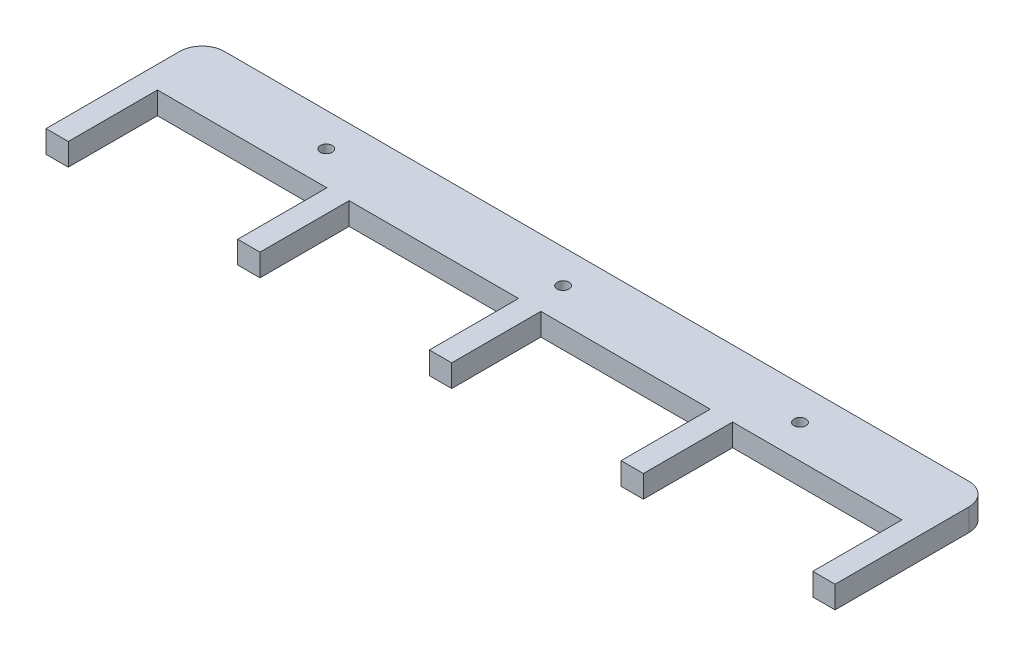
ISO-10303-21;
HEADER;
FILE_DESCRIPTION(('STEP AP214'),'2;1');
FILE_NAME('part.step','',(''),(''),'','','');
FILE_SCHEMA(('AUTOMOTIVE_DESIGN { 1 0 10303 214 1 1 1 1 }'));
ENDSEC;
DATA;
#1=APPLICATION_CONTEXT('core data for automotive mechanical design processes');
#2=APPLICATION_PROTOCOL_DEFINITION('international standard','automotive_design',2000,#1);
#3=PRODUCT_CONTEXT('',#1,'mechanical');
#4=PRODUCT('Part','Part','',(#3));
#5=PRODUCT_RELATED_PRODUCT_CATEGORY('part','',(#4));
#6=PRODUCT_DEFINITION_FORMATION('','',#4);
#7=PRODUCT_DEFINITION_CONTEXT('part definition',#1,'design');
#8=PRODUCT_DEFINITION('design','',#6,#7);
#9=PRODUCT_DEFINITION_SHAPE('','',#8);
#10=(LENGTH_UNIT() NAMED_UNIT(*) SI_UNIT(.MILLI.,.METRE.));
#11=(NAMED_UNIT(*) PLANE_ANGLE_UNIT() SI_UNIT($,.RADIAN.));
#12=(NAMED_UNIT(*) SI_UNIT($,.STERADIAN.) SOLID_ANGLE_UNIT());
#13=UNCERTAINTY_MEASURE_WITH_UNIT(LENGTH_MEASURE(1.E-05),#10,'distance_accuracy_value','');
#14=(GEOMETRIC_REPRESENTATION_CONTEXT(3) GLOBAL_UNCERTAINTY_ASSIGNED_CONTEXT((#13)) GLOBAL_UNIT_ASSIGNED_CONTEXT((#10,
#11,#12)) REPRESENTATION_CONTEXT('',''));
#15=CARTESIAN_POINT('',(0.,0.,0.));
#16=DIRECTION('',(0.,0.,1.));
#17=DIRECTION('',(1.,0.,0.));
#18=AXIS2_PLACEMENT_3D('',#15,#16,#17);
#19=CARTESIAN_POINT('',(86.756875,6.35,-82.55));
#20=DIRECTION('',(0.,-1.,0.));
#21=DIRECTION('',(0.,0.,-1.));
#22=AXIS2_PLACEMENT_3D('',#19,#20,#21);
#23=PLANE('',#22);
#24=CARTESIAN_POINT('',(-19.288125,6.35,-79.375));
#25=DIRECTION('',(0.,1.,0.));
#26=DIRECTION('',(0.,0.,1.));
#27=AXIS2_PLACEMENT_3D('',#24,#25,#26);
#28=CIRCLE('',#27,1.70000000000001);
#29=CARTESIAN_POINT('',(-19.288125,6.35,-77.675));
#30=VERTEX_POINT('',#29);
#31=EDGE_CURVE('E417',#30,#30,#28,.T.);
#32=ORIENTED_EDGE('',*,*,#31,.F.);
#33=EDGE_LOOP('',(#32));
#34=FACE_BOUND('',#33,.T.);
#35=DIRECTION('',(1.,0.,0.));
#36=VECTOR('',#35,1.);
#37=CARTESIAN_POINT('',(-131.683125,6.35,-44.45));
#38=LINE('',#37,#36);
#39=CARTESIAN_POINT('',(-131.683125,6.35,-44.45));
#40=VERTEX_POINT('',#39);
#41=CARTESIAN_POINT('',(-125.333125,6.35,-44.45));
#42=VERTEX_POINT('',#41);
#43=EDGE_CURVE('E257',#40,#42,#38,.T.);
#44=ORIENTED_EDGE('',*,*,#43,.T.);
#45=DIRECTION('',(0.,0.,-1.));
#46=VECTOR('',#45,1.);
#47=CARTESIAN_POINT('',(-125.333125,6.35,-69.85));
#48=LINE('',#47,#46);
#49=CARTESIAN_POINT('',(-125.333125,6.35,-69.85));
#50=VERTEX_POINT('',#49);
#51=EDGE_CURVE('E135',#42,#50,#48,.T.);
#52=ORIENTED_EDGE('',*,*,#51,.T.);
#53=DIRECTION('',(1.,0.,0.));
#54=VECTOR('',#53,1.);
#55=CARTESIAN_POINT('',(-125.333125,6.35,-69.85));
#56=LINE('',#55,#54);
#57=CARTESIAN_POINT('',(-77.073125,6.35,-69.85));
#58=VERTEX_POINT('',#57);
#59=EDGE_CURVE('E314',#50,#58,#56,.T.);
#60=ORIENTED_EDGE('',*,*,#59,.T.);
#61=DIRECTION('',(0.,0.,1.));
#62=VECTOR('',#61,1.);
#63=CARTESIAN_POINT('',(-77.073125,6.35,-44.45));
#64=LINE('',#63,#62);
#65=CARTESIAN_POINT('',(-77.073125,6.35,-44.45));
#66=VERTEX_POINT('',#65);
#67=EDGE_CURVE('E333',#58,#66,#64,.T.);
#68=ORIENTED_EDGE('',*,*,#67,.T.);
#69=DIRECTION('',(1.,0.,0.));
#70=VECTOR('',#69,1.);
#71=CARTESIAN_POINT('',(-77.073125,6.35,-44.45));
#72=LINE('',#71,#70);
#73=CARTESIAN_POINT('',(-70.723125,6.35,-44.45));
#74=VERTEX_POINT('',#73);
#75=EDGE_CURVE('E330',#66,#74,#72,.T.);
#76=ORIENTED_EDGE('',*,*,#75,.T.);
#77=DIRECTION('',(0.,0.,-1.));
#78=VECTOR('',#77,1.);
#79=CARTESIAN_POINT('',(-70.723125,6.35,-44.45));
#80=LINE('',#79,#78);
#81=CARTESIAN_POINT('',(-70.723125,6.35,-69.85));
#82=VERTEX_POINT('',#81);
#83=EDGE_CURVE('E332',#74,#82,#80,.T.);
#84=ORIENTED_EDGE('',*,*,#83,.T.);
#85=DIRECTION('',(1.,0.,0.));
#86=VECTOR('',#85,1.);
#87=CARTESIAN_POINT('',(-70.723125,6.35,-69.85));
#88=LINE('',#87,#86);
#89=CARTESIAN_POINT('',(-22.463125,6.35,-69.85));
#90=VERTEX_POINT('',#89);
#91=EDGE_CURVE('E335',#82,#90,#88,.T.);
#92=ORIENTED_EDGE('',*,*,#91,.T.);
#93=DIRECTION('',(0.,0.,1.));
#94=VECTOR('',#93,1.);
#95=CARTESIAN_POINT('',(-22.463125,6.35,-69.85));
#96=LINE('',#95,#94);
#97=CARTESIAN_POINT('',(-22.463125,6.35,-44.45));
#98=VERTEX_POINT('',#97);
#99=EDGE_CURVE('E341',#90,#98,#96,.T.);
#100=ORIENTED_EDGE('',*,*,#99,.T.);
#101=DIRECTION('',(1.,0.,0.));
#102=VECTOR('',#101,1.);
#103=CARTESIAN_POINT('',(-22.463125,6.35,-44.45));
#104=LINE('',#103,#102);
#105=CARTESIAN_POINT('',(-16.113125,6.35,-44.45));
#106=VERTEX_POINT('',#105);
#107=EDGE_CURVE('E343',#98,#106,#104,.T.);
#108=ORIENTED_EDGE('',*,*,#107,.T.);
#109=DIRECTION('',(0.,0.,-1.));
#110=VECTOR('',#109,1.);
#111=CARTESIAN_POINT('',(-16.113125,6.35,-44.45));
#112=LINE('',#111,#110);
#113=CARTESIAN_POINT('',(-16.113125,6.35,-69.85));
#114=VERTEX_POINT('',#113);
#115=EDGE_CURVE('E345',#106,#114,#112,.T.);
#116=ORIENTED_EDGE('',*,*,#115,.T.);
#117=DIRECTION('',(1.,0.,0.));
#118=VECTOR('',#117,1.);
#119=CARTESIAN_POINT('',(-16.113125,6.35,-69.85));
#120=LINE('',#119,#118);
#121=CARTESIAN_POINT('',(32.146875,6.35,-69.85));
#122=VERTEX_POINT('',#121);
#123=EDGE_CURVE('E347',#114,#122,#120,.T.);
#124=ORIENTED_EDGE('',*,*,#123,.T.);
#125=DIRECTION('',(0.,0.,1.));
#126=VECTOR('',#125,1.);
#127=CARTESIAN_POINT('',(32.146875,6.35,-69.85));
#128=LINE('',#127,#126);
#129=CARTESIAN_POINT('',(32.146875,6.35,-44.45));
#130=VERTEX_POINT('',#129);
#131=EDGE_CURVE('E349',#122,#130,#128,.T.);
#132=ORIENTED_EDGE('',*,*,#131,.T.);
#133=DIRECTION('',(1.,0.,0.));
#134=VECTOR('',#133,1.);
#135=CARTESIAN_POINT('',(32.146875,6.35,-44.45));
#136=LINE('',#135,#134);
#137=CARTESIAN_POINT('',(38.496875,6.35,-44.45));
#138=VERTEX_POINT('',#137);
#139=EDGE_CURVE('E351',#130,#138,#136,.T.);
#140=ORIENTED_EDGE('',*,*,#139,.T.);
#141=DIRECTION('',(0.,0.,-1.));
#142=VECTOR('',#141,1.);
#143=CARTESIAN_POINT('',(38.496875,6.35,-44.45));
#144=LINE('',#143,#142);
#145=CARTESIAN_POINT('',(38.496875,6.35,-69.85));
#146=VERTEX_POINT('',#145);
#147=EDGE_CURVE('E353',#138,#146,#144,.T.);
#148=ORIENTED_EDGE('',*,*,#147,.T.);
#149=DIRECTION('',(1.,0.,0.));
#150=VECTOR('',#149,1.);
#151=CARTESIAN_POINT('',(38.496875,6.35,-69.85));
#152=LINE('',#151,#150);
#153=CARTESIAN_POINT('',(86.756875,6.35,-69.85));
#154=VERTEX_POINT('',#153);
#155=EDGE_CURVE('E355',#146,#154,#152,.T.);
#156=ORIENTED_EDGE('',*,*,#155,.T.);
#157=DIRECTION('',(0.,0.,1.));
#158=VECTOR('',#157,1.);
#159=CARTESIAN_POINT('',(86.756875,6.35,-69.85));
#160=LINE('',#159,#158);
#161=CARTESIAN_POINT('',(86.756875,6.35,-44.45));
#162=VERTEX_POINT('',#161);
#163=EDGE_CURVE('E357',#154,#162,#160,.T.);
#164=ORIENTED_EDGE('',*,*,#163,.T.);
#165=DIRECTION('',(1.,0.,0.));
#166=VECTOR('',#165,1.);
#167=CARTESIAN_POINT('',(86.756875,6.35,-44.45));
#168=LINE('',#167,#166);
#169=CARTESIAN_POINT('',(93.106875,6.35,-44.45));
#170=VERTEX_POINT('',#169);
#171=EDGE_CURVE('E359',#162,#170,#168,.T.);
#172=ORIENTED_EDGE('',*,*,#171,.T.);
#173=DIRECTION('',(0.,0.,-1.));
#174=VECTOR('',#173,1.);
#175=CARTESIAN_POINT('',(93.106875,6.35,-44.45));
#176=LINE('',#175,#174);
#177=CARTESIAN_POINT('',(93.106875,6.35,-82.55));
#178=VERTEX_POINT('',#177);
#179=EDGE_CURVE('E361',#170,#178,#176,.T.);
#180=ORIENTED_EDGE('',*,*,#179,.T.);
#181=CARTESIAN_POINT('',(86.756875,6.35,-82.55));
#182=DIRECTION('',(0.,1.,0.));
#183=DIRECTION('',(0.,0.,-1.));
#184=AXIS2_PLACEMENT_3D('',#181,#182,#183);
#185=CIRCLE('',#184,6.34999999999999);
#186=CARTESIAN_POINT('',(86.756875,6.35,-88.9));
#187=VERTEX_POINT('',#186);
#188=EDGE_CURVE('E196',#178,#187,#185,.T.);
#189=ORIENTED_EDGE('',*,*,#188,.T.);
#190=DIRECTION('',(-1.,0.,0.));
#191=VECTOR('',#190,1.);
#192=CARTESIAN_POINT('',(86.756875,6.35,-88.9));
#193=LINE('',#192,#191);
#194=CARTESIAN_POINT('',(-125.333125,6.35,-88.9));
#195=VERTEX_POINT('',#194);
#196=EDGE_CURVE('E190',#187,#195,#193,.T.);
#197=ORIENTED_EDGE('',*,*,#196,.T.);
#198=CARTESIAN_POINT('',(-125.333125,6.35,-82.55));
#199=DIRECTION('',(0.,1.,0.));
#200=DIRECTION('',(0.,0.,1.));
#201=AXIS2_PLACEMENT_3D('',#198,#199,#200);
#202=CIRCLE('',#201,6.34999999999999);
#203=CARTESIAN_POINT('',(-131.683125,6.35,-82.55));
#204=VERTEX_POINT('',#203);
#205=EDGE_CURVE('E194',#195,#204,#202,.T.);
#206=ORIENTED_EDGE('',*,*,#205,.T.);
#207=DIRECTION('',(0.,0.,1.));
#208=VECTOR('',#207,1.);
#209=CARTESIAN_POINT('',(-131.683125,6.35,-82.55));
#210=LINE('',#209,#208);
#211=EDGE_CURVE('E50',#204,#40,#210,.T.);
#212=ORIENTED_EDGE('',*,*,#211,.T.);
#213=EDGE_LOOP('',(#44,#52,#60,#68,#76,#84,#92,#100,#108,#116,#124,#132,#140,#148,#156,#164,
#172,#180,#189,#197,#206,#212));
#214=FACE_BOUND('',#213,.T.);
#215=CARTESIAN_POINT('',(-86.756875,6.35,-79.375));
#216=DIRECTION('',(0.,1.,0.));
#217=DIRECTION('',(0.,0.,1.));
#218=AXIS2_PLACEMENT_3D('',#215,#216,#217);
#219=CIRCLE('',#218,1.70000000000001);
#220=CARTESIAN_POINT('',(-86.756875,6.35,-77.6749999999999));
#221=VERTEX_POINT('',#220);
#222=EDGE_CURVE('E218',#221,#221,#219,.T.);
#223=ORIENTED_EDGE('',*,*,#222,.F.);
#224=EDGE_LOOP('',(#223));
#225=FACE_BOUND('',#224,.T.);
#226=CARTESIAN_POINT('',(48.180625,6.35,-79.375));
#227=DIRECTION('',(0.,1.,0.));
#228=DIRECTION('',(0.,0.,1.));
#229=AXIS2_PLACEMENT_3D('',#226,#227,#228);
#230=CIRCLE('',#229,1.7);
#231=CARTESIAN_POINT('',(48.180625,6.35,-77.675));
#232=VERTEX_POINT('',#231);
#233=EDGE_CURVE('E408',#232,#232,#230,.T.);
#234=ORIENTED_EDGE('',*,*,#233,.F.);
#235=EDGE_LOOP('',(#234));
#236=FACE_BOUND('',#235,.T.);
#237=ADVANCED_FACE('F33',(#34,#214,#225,#236),#23,.F.);
#238=CARTESIAN_POINT('',(86.756875,0.,-82.55));
#239=DIRECTION('',(0.,-1.,0.));
#240=DIRECTION('',(0.,0.,-1.));
#241=AXIS2_PLACEMENT_3D('',#238,#239,#240);
#242=PLANE('',#241);
#243=CARTESIAN_POINT('',(-19.288125,0.,-79.375));
#244=DIRECTION('',(0.,1.,0.));
#245=DIRECTION('',(0.,0.,1.));
#246=AXIS2_PLACEMENT_3D('',#243,#244,#245);
#247=CIRCLE('',#246,1.70000000000001);
#248=CARTESIAN_POINT('',(-19.288125,0.,-77.675));
#249=VERTEX_POINT('',#248);
#250=EDGE_CURVE('E414',#249,#249,#247,.T.);
#251=ORIENTED_EDGE('',*,*,#250,.T.);
#252=EDGE_LOOP('',(#251));
#253=FACE_BOUND('',#252,.T.);
#254=DIRECTION('',(1.,0.,0.));
#255=VECTOR('',#254,1.);
#256=CARTESIAN_POINT('',(-131.683125,0.,-44.45));
#257=LINE('',#256,#255);
#258=CARTESIAN_POINT('',(-131.683125,0.,-44.45));
#259=VERTEX_POINT('',#258);
#260=CARTESIAN_POINT('',(-125.333125,0.,-44.45));
#261=VERTEX_POINT('',#260);
#262=EDGE_CURVE('E214',#259,#261,#257,.T.);
#263=ORIENTED_EDGE('',*,*,#262,.F.);
#264=DIRECTION('',(0.,0.,1.));
#265=VECTOR('',#264,1.);
#266=CARTESIAN_POINT('',(-131.683125,0.,-82.55));
#267=LINE('',#266,#265);
#268=CARTESIAN_POINT('',(-131.683125,0.,-82.55));
#269=VERTEX_POINT('',#268);
#270=EDGE_CURVE('E127',#269,#259,#267,.T.);
#271=ORIENTED_EDGE('',*,*,#270,.F.);
#272=CARTESIAN_POINT('',(-125.333125,0.,-82.55));
#273=DIRECTION('',(0.,1.,0.));
#274=DIRECTION('',(0.,0.,1.));
#275=AXIS2_PLACEMENT_3D('',#272,#273,#274);
#276=CIRCLE('',#275,6.34999999999999);
#277=CARTESIAN_POINT('',(-125.333125,0.,-88.9));
#278=VERTEX_POINT('',#277);
#279=EDGE_CURVE('E121',#278,#269,#276,.T.);
#280=ORIENTED_EDGE('',*,*,#279,.F.);
#281=DIRECTION('',(-1.,0.,0.));
#282=VECTOR('',#281,1.);
#283=CARTESIAN_POINT('',(86.756875,0.,-88.9));
#284=LINE('',#283,#282);
#285=CARTESIAN_POINT('',(86.756875,0.,-88.9));
#286=VERTEX_POINT('',#285);
#287=EDGE_CURVE('E204',#286,#278,#284,.T.);
#288=ORIENTED_EDGE('',*,*,#287,.F.);
#289=CARTESIAN_POINT('',(86.756875,0.,-82.55));
#290=DIRECTION('',(0.,1.,0.));
#291=DIRECTION('',(0.,0.,-1.));
#292=AXIS2_PLACEMENT_3D('',#289,#290,#291);
#293=CIRCLE('',#292,6.34999999999999);
#294=CARTESIAN_POINT('',(93.106875,0.,-82.55));
#295=VERTEX_POINT('',#294);
#296=EDGE_CURVE('E252',#295,#286,#293,.T.);
#297=ORIENTED_EDGE('',*,*,#296,.F.);
#298=DIRECTION('',(0.,0.,-1.));
#299=VECTOR('',#298,1.);
#300=CARTESIAN_POINT('',(93.106875,0.,-44.45));
#301=LINE('',#300,#299);
#302=CARTESIAN_POINT('',(93.106875,0.,-44.45));
#303=VERTEX_POINT('',#302);
#304=EDGE_CURVE('E250',#303,#295,#301,.T.);
#305=ORIENTED_EDGE('',*,*,#304,.F.);
#306=DIRECTION('',(1.,0.,0.));
#307=VECTOR('',#306,1.);
#308=CARTESIAN_POINT('',(86.756875,0.,-44.45));
#309=LINE('',#308,#307);
#310=CARTESIAN_POINT('',(86.756875,0.,-44.45));
#311=VERTEX_POINT('',#310);
#312=EDGE_CURVE('E248',#311,#303,#309,.T.);
#313=ORIENTED_EDGE('',*,*,#312,.F.);
#314=DIRECTION('',(0.,0.,1.));
#315=VECTOR('',#314,1.);
#316=CARTESIAN_POINT('',(86.756875,0.,-69.85));
#317=LINE('',#316,#315);
#318=CARTESIAN_POINT('',(86.756875,0.,-69.85));
#319=VERTEX_POINT('',#318);
#320=EDGE_CURVE('E246',#319,#311,#317,.T.);
#321=ORIENTED_EDGE('',*,*,#320,.F.);
#322=DIRECTION('',(1.,0.,0.));
#323=VECTOR('',#322,1.);
#324=CARTESIAN_POINT('',(38.496875,0.,-69.85));
#325=LINE('',#324,#323);
#326=CARTESIAN_POINT('',(38.496875,0.,-69.85));
#327=VERTEX_POINT('',#326);
#328=EDGE_CURVE('E244',#327,#319,#325,.T.);
#329=ORIENTED_EDGE('',*,*,#328,.F.);
#330=DIRECTION('',(0.,0.,-1.));
#331=VECTOR('',#330,1.);
#332=CARTESIAN_POINT('',(38.496875,0.,-44.45));
#333=LINE('',#332,#331);
#334=CARTESIAN_POINT('',(38.496875,0.,-44.45));
#335=VERTEX_POINT('',#334);
#336=EDGE_CURVE('E242',#335,#327,#333,.T.);
#337=ORIENTED_EDGE('',*,*,#336,.F.);
#338=DIRECTION('',(1.,0.,0.));
#339=VECTOR('',#338,1.);
#340=CARTESIAN_POINT('',(32.146875,0.,-44.45));
#341=LINE('',#340,#339);
#342=CARTESIAN_POINT('',(32.146875,0.,-44.45));
#343=VERTEX_POINT('',#342);
#344=EDGE_CURVE('E240',#343,#335,#341,.T.);
#345=ORIENTED_EDGE('',*,*,#344,.F.);
#346=DIRECTION('',(0.,0.,1.));
#347=VECTOR('',#346,1.);
#348=CARTESIAN_POINT('',(32.146875,0.,-69.85));
#349=LINE('',#348,#347);
#350=CARTESIAN_POINT('',(32.146875,0.,-69.85));
#351=VERTEX_POINT('',#350);
#352=EDGE_CURVE('E238',#351,#343,#349,.T.);
#353=ORIENTED_EDGE('',*,*,#352,.F.);
#354=DIRECTION('',(1.,0.,0.));
#355=VECTOR('',#354,1.);
#356=CARTESIAN_POINT('',(-16.113125,0.,-69.85));
#357=LINE('',#356,#355);
#358=CARTESIAN_POINT('',(-16.113125,0.,-69.85));
#359=VERTEX_POINT('',#358);
#360=EDGE_CURVE('E236',#359,#351,#357,.T.);
#361=ORIENTED_EDGE('',*,*,#360,.F.);
#362=DIRECTION('',(0.,0.,-1.));
#363=VECTOR('',#362,1.);
#364=CARTESIAN_POINT('',(-16.113125,0.,-44.45));
#365=LINE('',#364,#363);
#366=CARTESIAN_POINT('',(-16.113125,0.,-44.45));
#367=VERTEX_POINT('',#366);
#368=EDGE_CURVE('E234',#367,#359,#365,.T.);
#369=ORIENTED_EDGE('',*,*,#368,.F.);
#370=DIRECTION('',(1.,0.,0.));
#371=VECTOR('',#370,1.);
#372=CARTESIAN_POINT('',(-22.463125,0.,-44.45));
#373=LINE('',#372,#371);
#374=CARTESIAN_POINT('',(-22.463125,0.,-44.45));
#375=VERTEX_POINT('',#374);
#376=EDGE_CURVE('E232',#375,#367,#373,.T.);
#377=ORIENTED_EDGE('',*,*,#376,.F.);
#378=DIRECTION('',(0.,0.,1.));
#379=VECTOR('',#378,1.);
#380=CARTESIAN_POINT('',(-22.463125,0.,-69.85));
#381=LINE('',#380,#379);
#382=CARTESIAN_POINT('',(-22.463125,0.,-69.85));
#383=VERTEX_POINT('',#382);
#384=EDGE_CURVE('E230',#383,#375,#381,.T.);
#385=ORIENTED_EDGE('',*,*,#384,.F.);
#386=DIRECTION('',(1.,0.,0.));
#387=VECTOR('',#386,1.);
#388=CARTESIAN_POINT('',(-70.723125,0.,-69.85));
#389=LINE('',#388,#387);
#390=CARTESIAN_POINT('',(-70.723125,0.,-69.85));
#391=VERTEX_POINT('',#390);
#392=EDGE_CURVE('E228',#391,#383,#389,.T.);
#393=ORIENTED_EDGE('',*,*,#392,.F.);
#394=DIRECTION('',(0.,0.,-1.));
#395=VECTOR('',#394,1.);
#396=CARTESIAN_POINT('',(-70.723125,0.,-44.45));
#397=LINE('',#396,#395);
#398=CARTESIAN_POINT('',(-70.723125,0.,-44.45));
#399=VERTEX_POINT('',#398);
#400=EDGE_CURVE('E226',#399,#391,#397,.T.);
#401=ORIENTED_EDGE('',*,*,#400,.F.);
#402=DIRECTION('',(1.,0.,0.));
#403=VECTOR('',#402,1.);
#404=CARTESIAN_POINT('',(-77.073125,0.,-44.45));
#405=LINE('',#404,#403);
#406=CARTESIAN_POINT('',(-77.073125,0.,-44.45));
#407=VERTEX_POINT('',#406);
#408=EDGE_CURVE('E224',#407,#399,#405,.T.);
#409=ORIENTED_EDGE('',*,*,#408,.F.);
#410=DIRECTION('',(0.,0.,1.));
#411=VECTOR('',#410,1.);
#412=CARTESIAN_POINT('',(-77.073125,0.,-44.45));
#413=LINE('',#412,#411);
#414=CARTESIAN_POINT('',(-77.073125,0.,-69.85));
#415=VERTEX_POINT('',#414);
#416=EDGE_CURVE('E222',#415,#407,#413,.T.);
#417=ORIENTED_EDGE('',*,*,#416,.F.);
#418=DIRECTION('',(1.,0.,0.));
#419=VECTOR('',#418,1.);
#420=CARTESIAN_POINT('',(-125.333125,0.,-69.85));
#421=LINE('',#420,#419);
#422=CARTESIAN_POINT('',(-125.333125,0.,-69.85));
#423=VERTEX_POINT('',#422);
#424=EDGE_CURVE('E220',#423,#415,#421,.T.);
#425=ORIENTED_EDGE('',*,*,#424,.F.);
#426=DIRECTION('',(0.,0.,-1.));
#427=VECTOR('',#426,1.);
#428=CARTESIAN_POINT('',(-125.333125,0.,-69.85));
#429=LINE('',#428,#427);
#430=EDGE_CURVE('E217',#261,#423,#429,.T.);
#431=ORIENTED_EDGE('',*,*,#430,.F.);
#432=EDGE_LOOP('',(#263,#271,#280,#288,#297,#305,#313,#321,#329,#337,#345,#353,#361,#369,#377,
#385,#393,#401,#409,#417,#425,#431));
#433=FACE_BOUND('',#432,.T.);
#434=CARTESIAN_POINT('',(-86.756875,0.,-79.375));
#435=DIRECTION('',(0.,1.,0.));
#436=DIRECTION('',(0.,0.,1.));
#437=AXIS2_PLACEMENT_3D('',#434,#435,#436);
#438=CIRCLE('',#437,1.70000000000001);
#439=CARTESIAN_POINT('',(-86.756875,0.,-77.6749999999999));
#440=VERTEX_POINT('',#439);
#441=EDGE_CURVE('E420',#440,#440,#438,.T.);
#442=ORIENTED_EDGE('',*,*,#441,.T.);
#443=EDGE_LOOP('',(#442));
#444=FACE_BOUND('',#443,.T.);
#445=CARTESIAN_POINT('',(48.180625,0.,-79.375));
#446=DIRECTION('',(0.,1.,0.));
#447=DIRECTION('',(0.,0.,1.));
#448=AXIS2_PLACEMENT_3D('',#445,#446,#447);
#449=CIRCLE('',#448,1.7);
#450=CARTESIAN_POINT('',(48.180625,0.,-77.675));
#451=VERTEX_POINT('',#450);
#452=EDGE_CURVE('E411',#451,#451,#449,.T.);
#453=ORIENTED_EDGE('',*,*,#452,.T.);
#454=EDGE_LOOP('',(#453));
#455=FACE_BOUND('',#454,.T.);
#456=ADVANCED_FACE('F318',(#253,#433,#444,#455),#242,.T.);
#457=CARTESIAN_POINT('',(-131.683125,6.35,-44.45));
#458=DIRECTION('',(0.,0.,-1.));
#459=DIRECTION('',(-1.,0.,0.));
#460=AXIS2_PLACEMENT_3D('',#457,#458,#459);
#461=PLANE('',#460);
#462=ORIENTED_EDGE('',*,*,#262,.T.);
#463=DIRECTION('',(0.,-1.,0.));
#464=VECTOR('',#463,1.);
#465=CARTESIAN_POINT('',(-125.333125,6.35,-44.45));
#466=LINE('',#465,#464);
#467=EDGE_CURVE('E11',#42,#261,#466,.T.);
#468=ORIENTED_EDGE('',*,*,#467,.F.);
#469=ORIENTED_EDGE('',*,*,#43,.F.);
#470=DIRECTION('',(0.,-1.,0.));
#471=VECTOR('',#470,1.);
#472=CARTESIAN_POINT('',(-131.683125,6.35,-44.45));
#473=LINE('',#472,#471);
#474=EDGE_CURVE('E210',#40,#259,#473,.T.);
#475=ORIENTED_EDGE('',*,*,#474,.T.);
#476=EDGE_LOOP('',(#462,#468,#469,#475));
#477=FACE_BOUND('',#476,.T.);
#478=ADVANCED_FACE('F35',(#477),#461,.F.);
#479=CARTESIAN_POINT('',(-125.333125,6.35,-69.85));
#480=DIRECTION('',(-1.,0.,0.));
#481=DIRECTION('',(0.,0.,1.));
#482=AXIS2_PLACEMENT_3D('',#479,#480,#481);
#483=PLANE('',#482);
#484=ORIENTED_EDGE('',*,*,#430,.T.);
#485=DIRECTION('',(0.,-1.,0.));
#486=VECTOR('',#485,1.);
#487=CARTESIAN_POINT('',(-125.333125,6.35,-69.85));
#488=LINE('',#487,#486);
#489=EDGE_CURVE('E42',#50,#423,#488,.T.);
#490=ORIENTED_EDGE('',*,*,#489,.F.);
#491=ORIENTED_EDGE('',*,*,#51,.F.);
#492=ORIENTED_EDGE('',*,*,#467,.T.);
#493=EDGE_LOOP('',(#484,#490,#491,#492));
#494=FACE_BOUND('',#493,.T.);
#495=ADVANCED_FACE('F621',(#494),#483,.F.);
#496=CARTESIAN_POINT('',(-125.333125,6.35,-69.85));
#497=DIRECTION('',(0.,0.,-1.));
#498=DIRECTION('',(-1.,0.,0.));
#499=AXIS2_PLACEMENT_3D('',#496,#497,#498);
#500=PLANE('',#499);
#501=ORIENTED_EDGE('',*,*,#424,.T.);
#502=DIRECTION('',(0.,-1.,0.));
#503=VECTOR('',#502,1.);
#504=CARTESIAN_POINT('',(-77.073125,6.35,-69.85));
#505=LINE('',#504,#503);
#506=EDGE_CURVE('E306',#58,#415,#505,.T.);
#507=ORIENTED_EDGE('',*,*,#506,.F.);
#508=ORIENTED_EDGE('',*,*,#59,.F.);
#509=ORIENTED_EDGE('',*,*,#489,.T.);
#510=EDGE_LOOP('',(#501,#507,#508,#509));
#511=FACE_BOUND('',#510,.T.);
#512=ADVANCED_FACE('F312',(#511),#500,.F.);
#513=CARTESIAN_POINT('',(-77.073125,6.35,-44.45));
#514=DIRECTION('',(1.,0.,0.));
#515=DIRECTION('',(0.,0.,-1.));
#516=AXIS2_PLACEMENT_3D('',#513,#514,#515);
#517=PLANE('',#516);
#518=ORIENTED_EDGE('',*,*,#416,.T.);
#519=DIRECTION('',(0.,-1.,0.));
#520=VECTOR('',#519,1.);
#521=CARTESIAN_POINT('',(-77.073125,6.35,-44.45));
#522=LINE('',#521,#520);
#523=EDGE_CURVE('E303',#66,#407,#522,.T.);
#524=ORIENTED_EDGE('',*,*,#523,.F.);
#525=ORIENTED_EDGE('',*,*,#67,.F.);
#526=ORIENTED_EDGE('',*,*,#506,.T.);
#527=EDGE_LOOP('',(#518,#524,#525,#526));
#528=FACE_BOUND('',#527,.T.);
#529=ADVANCED_FACE('F324',(#528),#517,.F.);
#530=CARTESIAN_POINT('',(-77.073125,6.35,-44.45));
#531=DIRECTION('',(0.,0.,-1.));
#532=DIRECTION('',(-1.,0.,0.));
#533=AXIS2_PLACEMENT_3D('',#530,#531,#532);
#534=PLANE('',#533);
#535=ORIENTED_EDGE('',*,*,#408,.T.);
#536=DIRECTION('',(0.,-1.,0.));
#537=VECTOR('',#536,1.);
#538=CARTESIAN_POINT('',(-70.723125,6.35,-44.45));
#539=LINE('',#538,#537);
#540=EDGE_CURVE('E300',#74,#399,#539,.T.);
#541=ORIENTED_EDGE('',*,*,#540,.F.);
#542=ORIENTED_EDGE('',*,*,#75,.F.);
#543=ORIENTED_EDGE('',*,*,#523,.T.);
#544=EDGE_LOOP('',(#535,#541,#542,#543));
#545=FACE_BOUND('',#544,.T.);
#546=ADVANCED_FACE('F328',(#545),#534,.F.);
#547=CARTESIAN_POINT('',(-70.723125,6.35,-44.45));
#548=DIRECTION('',(-1.,0.,0.));
#549=DIRECTION('',(0.,0.,1.));
#550=AXIS2_PLACEMENT_3D('',#547,#548,#549);
#551=PLANE('',#550);
#552=ORIENTED_EDGE('',*,*,#400,.T.);
#553=DIRECTION('',(0.,-1.,0.));
#554=VECTOR('',#553,1.);
#555=CARTESIAN_POINT('',(-70.723125,6.35,-69.85));
#556=LINE('',#555,#554);
#557=EDGE_CURVE('E297',#82,#391,#556,.T.);
#558=ORIENTED_EDGE('',*,*,#557,.F.);
#559=ORIENTED_EDGE('',*,*,#83,.F.);
#560=ORIENTED_EDGE('',*,*,#540,.T.);
#561=EDGE_LOOP('',(#552,#558,#559,#560));
#562=FACE_BOUND('',#561,.T.);
#563=ADVANCED_FACE('F586',(#562),#551,.F.);
#564=CARTESIAN_POINT('',(-70.723125,6.35,-69.85));
#565=DIRECTION('',(0.,0.,-1.));
#566=DIRECTION('',(-1.,0.,0.));
#567=AXIS2_PLACEMENT_3D('',#564,#565,#566);
#568=PLANE('',#567);
#569=ORIENTED_EDGE('',*,*,#392,.T.);
#570=DIRECTION('',(0.,-1.,0.));
#571=VECTOR('',#570,1.);
#572=CARTESIAN_POINT('',(-22.463125,6.35,-69.85));
#573=LINE('',#572,#571);
#574=EDGE_CURVE('E294',#90,#383,#573,.T.);
#575=ORIENTED_EDGE('',*,*,#574,.F.);
#576=ORIENTED_EDGE('',*,*,#91,.F.);
#577=ORIENTED_EDGE('',*,*,#557,.T.);
#578=EDGE_LOOP('',(#569,#575,#576,#577));
#579=FACE_BOUND('',#578,.T.);
#580=ADVANCED_FACE('F576',(#579),#568,.F.);
#581=CARTESIAN_POINT('',(-22.463125,6.35,-69.85));
#582=DIRECTION('',(1.,0.,0.));
#583=DIRECTION('',(0.,0.,-1.));
#584=AXIS2_PLACEMENT_3D('',#581,#582,#583);
#585=PLANE('',#584);
#586=ORIENTED_EDGE('',*,*,#384,.T.);
#587=DIRECTION('',(0.,-1.,0.));
#588=VECTOR('',#587,1.);
#589=CARTESIAN_POINT('',(-22.463125,6.35,-44.45));
#590=LINE('',#589,#588);
#591=EDGE_CURVE('E291',#98,#375,#590,.T.);
#592=ORIENTED_EDGE('',*,*,#591,.F.);
#593=ORIENTED_EDGE('',*,*,#99,.F.);
#594=ORIENTED_EDGE('',*,*,#574,.T.);
#595=EDGE_LOOP('',(#586,#592,#593,#594));
#596=FACE_BOUND('',#595,.T.);
#597=ADVANCED_FACE('F566',(#596),#585,.F.);
#598=CARTESIAN_POINT('',(-22.463125,6.35,-44.45));
#599=DIRECTION('',(0.,0.,-1.));
#600=DIRECTION('',(-1.,0.,0.));
#601=AXIS2_PLACEMENT_3D('',#598,#599,#600);
#602=PLANE('',#601);
#603=ORIENTED_EDGE('',*,*,#376,.T.);
#604=DIRECTION('',(0.,-1.,0.));
#605=VECTOR('',#604,1.);
#606=CARTESIAN_POINT('',(-16.113125,6.35,-44.45));
#607=LINE('',#606,#605);
#608=EDGE_CURVE('E288',#106,#367,#607,.T.);
#609=ORIENTED_EDGE('',*,*,#608,.F.);
#610=ORIENTED_EDGE('',*,*,#107,.F.);
#611=ORIENTED_EDGE('',*,*,#591,.T.);
#612=EDGE_LOOP('',(#603,#609,#610,#611));
#613=FACE_BOUND('',#612,.T.);
#614=ADVANCED_FACE('F556',(#613),#602,.F.);
#615=CARTESIAN_POINT('',(-16.113125,6.35,-44.45));
#616=DIRECTION('',(-1.,0.,0.));
#617=DIRECTION('',(0.,0.,1.));
#618=AXIS2_PLACEMENT_3D('',#615,#616,#617);
#619=PLANE('',#618);
#620=ORIENTED_EDGE('',*,*,#368,.T.);
#621=DIRECTION('',(0.,-1.,0.));
#622=VECTOR('',#621,1.);
#623=CARTESIAN_POINT('',(-16.113125,6.35,-69.85));
#624=LINE('',#623,#622);
#625=EDGE_CURVE('E285',#114,#359,#624,.T.);
#626=ORIENTED_EDGE('',*,*,#625,.F.);
#627=ORIENTED_EDGE('',*,*,#115,.F.);
#628=ORIENTED_EDGE('',*,*,#608,.T.);
#629=EDGE_LOOP('',(#620,#626,#627,#628));
#630=FACE_BOUND('',#629,.T.);
#631=ADVANCED_FACE('F546',(#630),#619,.F.);
#632=CARTESIAN_POINT('',(-16.113125,6.35,-69.85));
#633=DIRECTION('',(0.,0.,-1.));
#634=DIRECTION('',(-1.,0.,0.));
#635=AXIS2_PLACEMENT_3D('',#632,#633,#634);
#636=PLANE('',#635);
#637=ORIENTED_EDGE('',*,*,#360,.T.);
#638=DIRECTION('',(0.,-1.,0.));
#639=VECTOR('',#638,1.);
#640=CARTESIAN_POINT('',(32.146875,6.35,-69.85));
#641=LINE('',#640,#639);
#642=EDGE_CURVE('E282',#122,#351,#641,.T.);
#643=ORIENTED_EDGE('',*,*,#642,.F.);
#644=ORIENTED_EDGE('',*,*,#123,.F.);
#645=ORIENTED_EDGE('',*,*,#625,.T.);
#646=EDGE_LOOP('',(#637,#643,#644,#645));
#647=FACE_BOUND('',#646,.T.);
#648=ADVANCED_FACE('F536',(#647),#636,.F.);
#649=CARTESIAN_POINT('',(32.146875,6.35,-69.85));
#650=DIRECTION('',(1.,0.,0.));
#651=DIRECTION('',(0.,0.,-1.));
#652=AXIS2_PLACEMENT_3D('',#649,#650,#651);
#653=PLANE('',#652);
#654=ORIENTED_EDGE('',*,*,#352,.T.);
#655=DIRECTION('',(0.,-1.,0.));
#656=VECTOR('',#655,1.);
#657=CARTESIAN_POINT('',(32.146875,6.35,-44.45));
#658=LINE('',#657,#656);
#659=EDGE_CURVE('E279',#130,#343,#658,.T.);
#660=ORIENTED_EDGE('',*,*,#659,.F.);
#661=ORIENTED_EDGE('',*,*,#131,.F.);
#662=ORIENTED_EDGE('',*,*,#642,.T.);
#663=EDGE_LOOP('',(#654,#660,#661,#662));
#664=FACE_BOUND('',#663,.T.);
#665=ADVANCED_FACE('F526',(#664),#653,.F.);
#666=CARTESIAN_POINT('',(32.146875,6.35,-44.45));
#667=DIRECTION('',(0.,0.,-1.));
#668=DIRECTION('',(-1.,0.,0.));
#669=AXIS2_PLACEMENT_3D('',#666,#667,#668);
#670=PLANE('',#669);
#671=ORIENTED_EDGE('',*,*,#344,.T.);
#672=DIRECTION('',(0.,-1.,0.));
#673=VECTOR('',#672,1.);
#674=CARTESIAN_POINT('',(38.496875,6.35,-44.45));
#675=LINE('',#674,#673);
#676=EDGE_CURVE('E276',#138,#335,#675,.T.);
#677=ORIENTED_EDGE('',*,*,#676,.F.);
#678=ORIENTED_EDGE('',*,*,#139,.F.);
#679=ORIENTED_EDGE('',*,*,#659,.T.);
#680=EDGE_LOOP('',(#671,#677,#678,#679));
#681=FACE_BOUND('',#680,.T.);
#682=ADVANCED_FACE('F516',(#681),#670,.F.);
#683=CARTESIAN_POINT('',(38.496875,6.35,-44.45));
#684=DIRECTION('',(-1.,0.,0.));
#685=DIRECTION('',(0.,0.,1.));
#686=AXIS2_PLACEMENT_3D('',#683,#684,#685);
#687=PLANE('',#686);
#688=ORIENTED_EDGE('',*,*,#336,.T.);
#689=DIRECTION('',(0.,-1.,0.));
#690=VECTOR('',#689,1.);
#691=CARTESIAN_POINT('',(38.496875,6.35,-69.85));
#692=LINE('',#691,#690);
#693=EDGE_CURVE('E273',#146,#327,#692,.T.);
#694=ORIENTED_EDGE('',*,*,#693,.F.);
#695=ORIENTED_EDGE('',*,*,#147,.F.);
#696=ORIENTED_EDGE('',*,*,#676,.T.);
#697=EDGE_LOOP('',(#688,#694,#695,#696));
#698=FACE_BOUND('',#697,.T.);
#699=ADVANCED_FACE('F506',(#698),#687,.F.);
#700=CARTESIAN_POINT('',(38.496875,6.35,-69.85));
#701=DIRECTION('',(0.,0.,-1.));
#702=DIRECTION('',(-1.,0.,0.));
#703=AXIS2_PLACEMENT_3D('',#700,#701,#702);
#704=PLANE('',#703);
#705=ORIENTED_EDGE('',*,*,#328,.T.);
#706=DIRECTION('',(0.,-1.,0.));
#707=VECTOR('',#706,1.);
#708=CARTESIAN_POINT('',(86.756875,6.35,-69.85));
#709=LINE('',#708,#707);
#710=EDGE_CURVE('E270',#154,#319,#709,.T.);
#711=ORIENTED_EDGE('',*,*,#710,.F.);
#712=ORIENTED_EDGE('',*,*,#155,.F.);
#713=ORIENTED_EDGE('',*,*,#693,.T.);
#714=EDGE_LOOP('',(#705,#711,#712,#713));
#715=FACE_BOUND('',#714,.T.);
#716=ADVANCED_FACE('F496',(#715),#704,.F.);
#717=CARTESIAN_POINT('',(86.756875,6.35,-69.85));
#718=DIRECTION('',(1.,0.,0.));
#719=DIRECTION('',(0.,0.,-1.));
#720=AXIS2_PLACEMENT_3D('',#717,#718,#719);
#721=PLANE('',#720);
#722=ORIENTED_EDGE('',*,*,#320,.T.);
#723=DIRECTION('',(0.,-1.,0.));
#724=VECTOR('',#723,1.);
#725=CARTESIAN_POINT('',(86.756875,6.35,-44.45));
#726=LINE('',#725,#724);
#727=EDGE_CURVE('E267',#162,#311,#726,.T.);
#728=ORIENTED_EDGE('',*,*,#727,.F.);
#729=ORIENTED_EDGE('',*,*,#163,.F.);
#730=ORIENTED_EDGE('',*,*,#710,.T.);
#731=EDGE_LOOP('',(#722,#728,#729,#730));
#732=FACE_BOUND('',#731,.T.);
#733=ADVANCED_FACE('F486',(#732),#721,.F.);
#734=CARTESIAN_POINT('',(86.756875,6.35,-44.45));
#735=DIRECTION('',(0.,0.,-1.));
#736=DIRECTION('',(-1.,0.,0.));
#737=AXIS2_PLACEMENT_3D('',#734,#735,#736);
#738=PLANE('',#737);
#739=ORIENTED_EDGE('',*,*,#312,.T.);
#740=DIRECTION('',(0.,-1.,0.));
#741=VECTOR('',#740,1.);
#742=CARTESIAN_POINT('',(93.106875,6.35,-44.45));
#743=LINE('',#742,#741);
#744=EDGE_CURVE('E264',#170,#303,#743,.T.);
#745=ORIENTED_EDGE('',*,*,#744,.F.);
#746=ORIENTED_EDGE('',*,*,#171,.F.);
#747=ORIENTED_EDGE('',*,*,#727,.T.);
#748=EDGE_LOOP('',(#739,#745,#746,#747));
#749=FACE_BOUND('',#748,.T.);
#750=ADVANCED_FACE('F477',(#749),#738,.F.);
#751=CARTESIAN_POINT('',(93.106875,6.35,-44.45));
#752=DIRECTION('',(-1.,0.,0.));
#753=DIRECTION('',(0.,0.,1.));
#754=AXIS2_PLACEMENT_3D('',#751,#752,#753);
#755=PLANE('',#754);
#756=ORIENTED_EDGE('',*,*,#304,.T.);
#757=DIRECTION('',(0.,-1.,0.));
#758=VECTOR('',#757,1.);
#759=CARTESIAN_POINT('',(93.106875,6.35,-82.55));
#760=LINE('',#759,#758);
#761=EDGE_CURVE('E261',#178,#295,#760,.T.);
#762=ORIENTED_EDGE('',*,*,#761,.F.);
#763=ORIENTED_EDGE('',*,*,#179,.F.);
#764=ORIENTED_EDGE('',*,*,#744,.T.);
#765=EDGE_LOOP('',(#756,#762,#763,#764));
#766=FACE_BOUND('',#765,.T.);
#767=ADVANCED_FACE('F367',(#766),#755,.F.);
#768=CARTESIAN_POINT('',(86.756875,6.35,-82.55));
#769=DIRECTION('',(0.,-1.,0.));
#770=DIRECTION('',(0.,0.,-1.));
#771=AXIS2_PLACEMENT_3D('',#768,#769,#770);
#772=CYLINDRICAL_SURFACE('',#771,6.34999999999999);
#773=ORIENTED_EDGE('',*,*,#296,.T.);
#774=DIRECTION('',(0.,-1.,0.));
#775=VECTOR('',#774,1.);
#776=CARTESIAN_POINT('',(86.756875,6.35,-88.9));
#777=LINE('',#776,#775);
#778=EDGE_CURVE('E205',#187,#286,#777,.T.);
#779=ORIENTED_EDGE('',*,*,#778,.F.);
#780=ORIENTED_EDGE('',*,*,#188,.F.);
#781=ORIENTED_EDGE('',*,*,#761,.T.);
#782=EDGE_LOOP('',(#773,#779,#780,#781));
#783=FACE_BOUND('',#782,.T.);
#784=ADVANCED_FACE('F371',(#783),#772,.T.);
#785=CARTESIAN_POINT('',(86.756875,6.35,-88.9));
#786=DIRECTION('',(0.,0.,1.));
#787=DIRECTION('',(1.,0.,0.));
#788=AXIS2_PLACEMENT_3D('',#785,#786,#787);
#789=PLANE('',#788);
#790=ORIENTED_EDGE('',*,*,#287,.T.);
#791=DIRECTION('',(0.,-1.,0.));
#792=VECTOR('',#791,1.);
#793=CARTESIAN_POINT('',(-125.333125,6.35,-88.9));
#794=LINE('',#793,#792);
#795=EDGE_CURVE('E201',#195,#278,#794,.T.);
#796=ORIENTED_EDGE('',*,*,#795,.F.);
#797=ORIENTED_EDGE('',*,*,#196,.F.);
#798=ORIENTED_EDGE('',*,*,#778,.T.);
#799=EDGE_LOOP('',(#790,#796,#797,#798));
#800=FACE_BOUND('',#799,.T.);
#801=ADVANCED_FACE('F202',(#800),#789,.F.);
#802=CARTESIAN_POINT('',(-125.333125,6.35,-82.55));
#803=DIRECTION('',(0.,-1.,0.));
#804=DIRECTION('',(0.,0.,-1.));
#805=AXIS2_PLACEMENT_3D('',#802,#803,#804);
#806=CYLINDRICAL_SURFACE('',#805,6.34999999999999);
#807=ORIENTED_EDGE('',*,*,#279,.T.);
#808=DIRECTION('',(0.,-1.,0.));
#809=VECTOR('',#808,1.);
#810=CARTESIAN_POINT('',(-131.683125,6.35,-82.55));
#811=LINE('',#810,#809);
#812=EDGE_CURVE('E206',#204,#269,#811,.T.);
#813=ORIENTED_EDGE('',*,*,#812,.F.);
#814=ORIENTED_EDGE('',*,*,#205,.F.);
#815=ORIENTED_EDGE('',*,*,#795,.T.);
#816=EDGE_LOOP('',(#807,#813,#814,#815));
#817=FACE_BOUND('',#816,.T.);
#818=ADVANCED_FACE('F208',(#817),#806,.T.);
#819=CARTESIAN_POINT('',(-131.683125,6.35,-82.55));
#820=DIRECTION('',(1.,0.,0.));
#821=DIRECTION('',(0.,0.,-1.));
#822=AXIS2_PLACEMENT_3D('',#819,#820,#821);
#823=PLANE('',#822);
#824=ORIENTED_EDGE('',*,*,#270,.T.);
#825=ORIENTED_EDGE('',*,*,#474,.F.);
#826=ORIENTED_EDGE('',*,*,#211,.F.);
#827=ORIENTED_EDGE('',*,*,#812,.T.);
#828=EDGE_LOOP('',(#824,#825,#826,#827));
#829=FACE_BOUND('',#828,.T.);
#830=ADVANCED_FACE('F375',(#829),#823,.F.);
#831=CARTESIAN_POINT('',(-86.756875,6.35,-79.375));
#832=DIRECTION('',(0.,-1.,0.));
#833=DIRECTION('',(0.,0.,-1.));
#834=AXIS2_PLACEMENT_3D('',#831,#832,#833);
#835=CYLINDRICAL_SURFACE('',#834,1.70000000000001);
#836=ORIENTED_EDGE('',*,*,#222,.T.);
#837=EDGE_LOOP('',(#836));
#838=FACE_BOUND('',#837,.T.);
#839=ORIENTED_EDGE('',*,*,#441,.F.);
#840=EDGE_LOOP('',(#839));
#841=FACE_BOUND('',#840,.T.);
#842=ADVANCED_FACE('F377',(#838,#841),#835,.F.);
#843=CARTESIAN_POINT('',(-19.288125,6.35,-79.375));
#844=DIRECTION('',(0.,-1.,0.));
#845=DIRECTION('',(0.,0.,-1.));
#846=AXIS2_PLACEMENT_3D('',#843,#844,#845);
#847=CYLINDRICAL_SURFACE('',#846,1.70000000000001);
#848=ORIENTED_EDGE('',*,*,#31,.T.);
#849=EDGE_LOOP('',(#848));
#850=FACE_BOUND('',#849,.T.);
#851=ORIENTED_EDGE('',*,*,#250,.F.);
#852=EDGE_LOOP('',(#851));
#853=FACE_BOUND('',#852,.T.);
#854=ADVANCED_FACE('F383',(#850,#853),#847,.F.);
#855=CARTESIAN_POINT('',(48.180625,6.35,-79.375));
#856=DIRECTION('',(0.,-1.,0.));
#857=DIRECTION('',(0.,0.,-1.));
#858=AXIS2_PLACEMENT_3D('',#855,#856,#857);
#859=CYLINDRICAL_SURFACE('',#858,1.7);
#860=ORIENTED_EDGE('',*,*,#233,.T.);
#861=EDGE_LOOP('',(#860));
#862=FACE_BOUND('',#861,.T.);
#863=ORIENTED_EDGE('',*,*,#452,.F.);
#864=EDGE_LOOP('',(#863));
#865=FACE_BOUND('',#864,.T.);
#866=ADVANCED_FACE('F399',(#862,#865),#859,.F.);
#867=CLOSED_SHELL('',(#237,#456,#478,#495,#512,#529,#546,#563,#580,#597,#614,#631,#648,#665,
#682,#699,#716,#733,#750,#767,#784,#801,#818,#830,#842,#854,#866));
#868=MANIFOLD_SOLID_BREP('B2',#867);
#869=ADVANCED_BREP_SHAPE_REPRESENTATION('',(#18,#868),#14);
#870=SHAPE_DEFINITION_REPRESENTATION(#9,#869);
ENDSEC;
END-ISO-10303-21;
